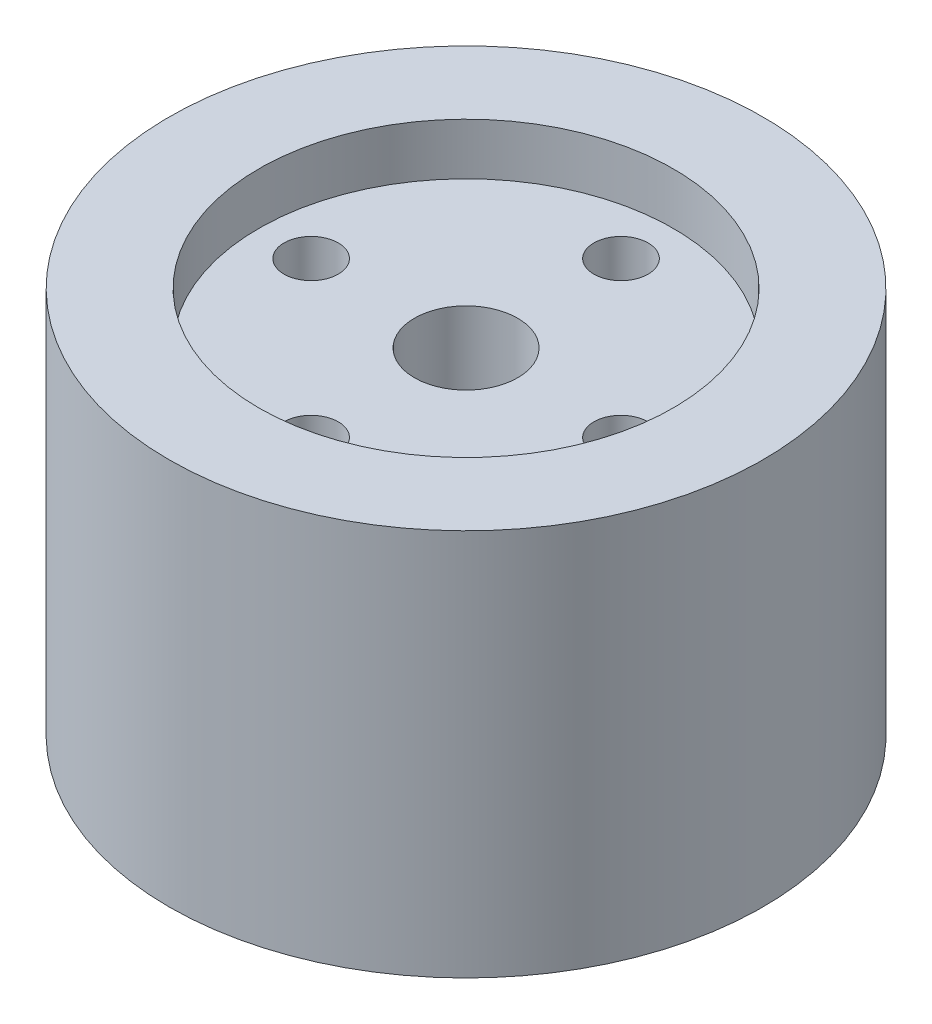
ISO-10303-21;
HEADER;
FILE_DESCRIPTION(('STEP AP214'),'2;1');
FILE_NAME('part.step','',(''),(''),'','','');
FILE_SCHEMA(('AUTOMOTIVE_DESIGN { 1 0 10303 214 1 1 1 1 }'));
ENDSEC;
DATA;
#1=APPLICATION_CONTEXT('core data for automotive mechanical design processes');
#2=APPLICATION_PROTOCOL_DEFINITION('international standard','automotive_design',2000,#1);
#3=PRODUCT_CONTEXT('',#1,'mechanical');
#4=PRODUCT('Part','Part','',(#3));
#5=PRODUCT_RELATED_PRODUCT_CATEGORY('part','',(#4));
#6=PRODUCT_DEFINITION_FORMATION('','',#4);
#7=PRODUCT_DEFINITION_CONTEXT('part definition',#1,'design');
#8=PRODUCT_DEFINITION('design','',#6,#7);
#9=PRODUCT_DEFINITION_SHAPE('','',#8);
#10=(LENGTH_UNIT() NAMED_UNIT(*) SI_UNIT(.MILLI.,.METRE.));
#11=(NAMED_UNIT(*) PLANE_ANGLE_UNIT() SI_UNIT($,.RADIAN.));
#12=(NAMED_UNIT(*) SI_UNIT($,.STERADIAN.) SOLID_ANGLE_UNIT());
#13=UNCERTAINTY_MEASURE_WITH_UNIT(LENGTH_MEASURE(1.E-05),#10,'distance_accuracy_value','');
#14=(GEOMETRIC_REPRESENTATION_CONTEXT(3) GLOBAL_UNCERTAINTY_ASSIGNED_CONTEXT((#13)) GLOBAL_UNIT_ASSIGNED_CONTEXT((#10,
#11,#12)) REPRESENTATION_CONTEXT('',''));
#15=CARTESIAN_POINT('',(0.,0.,0.));
#16=DIRECTION('',(0.,0.,1.));
#17=DIRECTION('',(1.,0.,0.));
#18=AXIS2_PLACEMENT_3D('',#15,#16,#17);
#19=CARTESIAN_POINT('',(0.,30.,-12.));
#20=DIRECTION('',(0.,-1.,0.));
#21=DIRECTION('',(0.,0.,-1.));
#22=AXIS2_PLACEMENT_3D('',#19,#20,#21);
#23=CYLINDRICAL_SURFACE('',#22,2.1);
#24=CARTESIAN_POINT('',(0.,26.,-12.));
#25=DIRECTION('',(0.,1.,0.));
#26=DIRECTION('',(0.,0.,1.));
#27=AXIS2_PLACEMENT_3D('',#24,#25,#26);
#28=CIRCLE('',#27,2.1);
#29=CARTESIAN_POINT('',(0.,26.,-9.9));
#30=VERTEX_POINT('',#29);
#31=EDGE_CURVE('E410',#30,#30,#28,.T.);
#32=ORIENTED_EDGE('',*,*,#31,.T.);
#33=EDGE_LOOP('',(#32));
#34=FACE_BOUND('',#33,.T.);
#35=CARTESIAN_POINT('',(0.,12.,-12.));
#36=DIRECTION('',(0.,-1.,0.));
#37=DIRECTION('',(0.,0.,-1.));
#38=AXIS2_PLACEMENT_3D('',#35,#36,#37);
#39=CIRCLE('',#38,2.1);
#40=CARTESIAN_POINT('',(0.,12.,-14.1));
#41=VERTEX_POINT('',#40);
#42=EDGE_CURVE('E41',#41,#41,#39,.T.);
#43=ORIENTED_EDGE('',*,*,#42,.T.);
#44=EDGE_LOOP('',(#43));
#45=FACE_BOUND('',#44,.T.);
#46=ADVANCED_FACE('F37',(#34,#45),#23,.F.);
#47=CARTESIAN_POINT('',(12.,30.,0.));
#48=DIRECTION('',(0.,-1.,0.));
#49=DIRECTION('',(0.,0.,-1.));
#50=AXIS2_PLACEMENT_3D('',#47,#48,#49);
#51=CYLINDRICAL_SURFACE('',#50,2.1);
#52=CARTESIAN_POINT('',(12.,26.,0.));
#53=DIRECTION('',(0.,1.,0.));
#54=DIRECTION('',(0.,0.,1.));
#55=AXIS2_PLACEMENT_3D('',#52,#53,#54);
#56=CIRCLE('',#55,2.1);
#57=CARTESIAN_POINT('',(12.,26.,2.10000000000004));
#58=VERTEX_POINT('',#57);
#59=EDGE_CURVE('E407',#58,#58,#56,.T.);
#60=ORIENTED_EDGE('',*,*,#59,.T.);
#61=EDGE_LOOP('',(#60));
#62=FACE_BOUND('',#61,.T.);
#63=CARTESIAN_POINT('',(12.,12.,0.));
#64=DIRECTION('',(0.,-1.,0.));
#65=DIRECTION('',(0.,0.,-1.));
#66=AXIS2_PLACEMENT_3D('',#63,#64,#65);
#67=CIRCLE('',#66,2.1);
#68=CARTESIAN_POINT('',(12.,12.,-2.09999999999996));
#69=VERTEX_POINT('',#68);
#70=EDGE_CURVE('E427',#69,#69,#67,.T.);
#71=ORIENTED_EDGE('',*,*,#70,.T.);
#72=EDGE_LOOP('',(#71));
#73=FACE_BOUND('',#72,.T.);
#74=ADVANCED_FACE('F516',(#62,#73),#51,.F.);
#75=CARTESIAN_POINT('',(0.,30.,12.));
#76=DIRECTION('',(0.,-1.,0.));
#77=DIRECTION('',(0.,0.,-1.));
#78=AXIS2_PLACEMENT_3D('',#75,#76,#77);
#79=CYLINDRICAL_SURFACE('',#78,2.1);
#80=CARTESIAN_POINT('',(0.,26.,12.));
#81=DIRECTION('',(0.,1.,0.));
#82=DIRECTION('',(0.,0.,1.));
#83=AXIS2_PLACEMENT_3D('',#80,#81,#82);
#84=CIRCLE('',#83,2.1);
#85=CARTESIAN_POINT('',(0.,26.,14.1));
#86=VERTEX_POINT('',#85);
#87=EDGE_CURVE('E404',#86,#86,#84,.T.);
#88=ORIENTED_EDGE('',*,*,#87,.T.);
#89=EDGE_LOOP('',(#88));
#90=FACE_BOUND('',#89,.T.);
#91=CARTESIAN_POINT('',(0.,12.,12.));
#92=DIRECTION('',(0.,-1.,0.));
#93=DIRECTION('',(0.,0.,-1.));
#94=AXIS2_PLACEMENT_3D('',#91,#92,#93);
#95=CIRCLE('',#94,2.1);
#96=CARTESIAN_POINT('',(0.,12.,9.9));
#97=VERTEX_POINT('',#96);
#98=EDGE_CURVE('E425',#97,#97,#95,.T.);
#99=ORIENTED_EDGE('',*,*,#98,.T.);
#100=EDGE_LOOP('',(#99));
#101=FACE_BOUND('',#100,.T.);
#102=ADVANCED_FACE('F522',(#90,#101),#79,.F.);
#103=CARTESIAN_POINT('',(-12.,30.,-1.25693328198353E-13));
#104=DIRECTION('',(0.,-1.,0.));
#105=DIRECTION('',(0.,0.,-1.));
#106=AXIS2_PLACEMENT_3D('',#103,#104,#105);
#107=CYLINDRICAL_SURFACE('',#106,2.1);
#108=CARTESIAN_POINT('',(-12.,26.,-1.25693328198353E-13));
#109=DIRECTION('',(0.,1.,0.));
#110=DIRECTION('',(0.,0.,1.));
#111=AXIS2_PLACEMENT_3D('',#108,#109,#110);
#112=CIRCLE('',#111,2.1);
#113=CARTESIAN_POINT('',(-12.,26.,2.09999999999987));
#114=VERTEX_POINT('',#113);
#115=EDGE_CURVE('E400',#114,#114,#112,.T.);
#116=ORIENTED_EDGE('',*,*,#115,.T.);
#117=EDGE_LOOP('',(#116));
#118=FACE_BOUND('',#117,.T.);
#119=CARTESIAN_POINT('',(-12.,12.,-1.25693328198353E-13));
#120=DIRECTION('',(0.,-1.,0.));
#121=DIRECTION('',(0.,0.,-1.));
#122=AXIS2_PLACEMENT_3D('',#119,#120,#121);
#123=CIRCLE('',#122,2.1);
#124=CARTESIAN_POINT('',(-12.,12.,-2.10000000000013));
#125=VERTEX_POINT('',#124);
#126=EDGE_CURVE('E248',#125,#125,#123,.T.);
#127=ORIENTED_EDGE('',*,*,#126,.T.);
#128=EDGE_LOOP('',(#127));
#129=FACE_BOUND('',#128,.T.);
#130=ADVANCED_FACE('F481',(#118,#129),#107,.F.);
#131=CARTESIAN_POINT('',(0.,30.,0.));
#132=DIRECTION('',(0.,-1.,0.));
#133=DIRECTION('',(0.,0.,-1.));
#134=AXIS2_PLACEMENT_3D('',#131,#132,#133);
#135=CYLINDRICAL_SURFACE('',#134,4.);
#136=CARTESIAN_POINT('',(0.,0.,0.));
#137=DIRECTION('',(0.,1.,0.));
#138=DIRECTION('',(0.,0.,1.));
#139=AXIS2_PLACEMENT_3D('',#136,#137,#138);
#140=CIRCLE('',#139,4.);
#141=CARTESIAN_POINT('',(0.,0.,4.));
#142=VERTEX_POINT('',#141);
#143=EDGE_CURVE('E416',#142,#142,#140,.T.);
#144=ORIENTED_EDGE('',*,*,#143,.F.);
#145=EDGE_LOOP('',(#144));
#146=FACE_BOUND('',#145,.T.);
#147=CARTESIAN_POINT('',(0.,26.,0.));
#148=DIRECTION('',(0.,1.,0.));
#149=DIRECTION('',(0.,0.,1.));
#150=AXIS2_PLACEMENT_3D('',#147,#148,#149);
#151=CIRCLE('',#150,4.);
#152=CARTESIAN_POINT('',(0.,26.,4.));
#153=VERTEX_POINT('',#152);
#154=EDGE_CURVE('E413',#153,#153,#151,.T.);
#155=ORIENTED_EDGE('',*,*,#154,.T.);
#156=EDGE_LOOP('',(#155));
#157=FACE_BOUND('',#156,.T.);
#158=ADVANCED_FACE('F478',(#146,#157),#135,.F.);
#159=CARTESIAN_POINT('',(0.,30.,0.));
#160=DIRECTION('',(0.,1.,0.));
#161=DIRECTION('',(0.,0.,1.));
#162=AXIS2_PLACEMENT_3D('',#159,#160,#161);
#163=PLANE('',#162);
#164=CARTESIAN_POINT('',(0.,30.,0.));
#165=DIRECTION('',(0.,1.,0.));
#166=DIRECTION('',(0.,0.,1.));
#167=AXIS2_PLACEMENT_3D('',#164,#165,#166);
#168=CIRCLE('',#167,16.05);
#169=CARTESIAN_POINT('',(0.,30.,16.05));
#170=VERTEX_POINT('',#169);
#171=EDGE_CURVE('E401',#170,#170,#168,.T.);
#172=ORIENTED_EDGE('',*,*,#171,.F.);
#173=EDGE_LOOP('',(#172));
#174=FACE_BOUND('',#173,.T.);
#175=CARTESIAN_POINT('',(0.,30.,0.));
#176=DIRECTION('',(0.,1.,0.));
#177=DIRECTION('',(0.,0.,1.));
#178=AXIS2_PLACEMENT_3D('',#175,#176,#177);
#179=CIRCLE('',#178,23.);
#180=CARTESIAN_POINT('',(0.,30.,23.));
#181=VERTEX_POINT('',#180);
#182=EDGE_CURVE('E11',#181,#181,#179,.T.);
#183=ORIENTED_EDGE('',*,*,#182,.T.);
#184=EDGE_LOOP('',(#183));
#185=FACE_BOUND('',#184,.T.);
#186=ADVANCED_FACE('F468',(#174,#185),#163,.T.);
#187=CARTESIAN_POINT('',(0.,0.,0.));
#188=DIRECTION('',(0.,1.,0.));
#189=DIRECTION('',(0.,0.,1.));
#190=AXIS2_PLACEMENT_3D('',#187,#188,#189);
#191=PLANE('',#190);
#192=DIRECTION('',(-0.5,0.,0.866025403784438));
#193=VECTOR('',#192,1.);
#194=CARTESIAN_POINT('',(4.15692193816522,0.,12.));
#195=LINE('',#194,#193);
#196=CARTESIAN_POINT('',(4.15692193816522,0.,12.));
#197=VERTEX_POINT('',#196);
#198=CARTESIAN_POINT('',(2.07846096908257,0.,15.6));
#199=VERTEX_POINT('',#198);
#200=EDGE_CURVE('E235',#197,#199,#195,.T.);
#201=ORIENTED_EDGE('',*,*,#200,.F.);
#202=DIRECTION('',(0.499999999999999,0.,0.866025403784439));
#203=VECTOR('',#202,1.);
#204=CARTESIAN_POINT('',(2.07846096908257,0.,8.4));
#205=LINE('',#204,#203);
#206=CARTESIAN_POINT('',(2.07846096908257,0.,8.4));
#207=VERTEX_POINT('',#206);
#208=EDGE_CURVE('E54',#207,#197,#205,.T.);
#209=ORIENTED_EDGE('',*,*,#208,.F.);
#210=DIRECTION('',(1.,0.,0.));
#211=VECTOR('',#210,1.);
#212=CARTESIAN_POINT('',(-2.07846096908273,0.,8.4));
#213=LINE('',#212,#211);
#214=CARTESIAN_POINT('',(-2.07846096908273,0.,8.4));
#215=VERTEX_POINT('',#214);
#216=EDGE_CURVE('E221',#215,#207,#213,.T.);
#217=ORIENTED_EDGE('',*,*,#216,.F.);
#218=DIRECTION('',(0.500000000000001,0.,-0.866025403784438));
#219=VECTOR('',#218,1.);
#220=CARTESIAN_POINT('',(-4.15692193816539,0.,12.));
#221=LINE('',#220,#219);
#222=CARTESIAN_POINT('',(-4.15692193816539,0.,12.));
#223=VERTEX_POINT('',#222);
#224=EDGE_CURVE('E224',#223,#215,#221,.T.);
#225=ORIENTED_EDGE('',*,*,#224,.F.);
#226=DIRECTION('',(-0.5,0.,-0.866025403784439));
#227=VECTOR('',#226,1.);
#228=CARTESIAN_POINT('',(-2.07846096908273,0.,15.6));
#229=LINE('',#228,#227);
#230=CARTESIAN_POINT('',(-2.07846096908273,0.,15.6));
#231=VERTEX_POINT('',#230);
#232=EDGE_CURVE('E241',#231,#223,#229,.T.);
#233=ORIENTED_EDGE('',*,*,#232,.F.);
#234=DIRECTION('',(-1.,0.,0.));
#235=VECTOR('',#234,1.);
#236=CARTESIAN_POINT('',(2.07846096908257,0.,15.6));
#237=LINE('',#236,#235);
#238=EDGE_CURVE('E238',#199,#231,#237,.T.);
#239=ORIENTED_EDGE('',*,*,#238,.F.);
#240=EDGE_LOOP('',(#201,#209,#217,#225,#233,#239));
#241=FACE_BOUND('',#240,.T.);
#242=DIRECTION('',(0.866025403784439,0.,0.5));
#243=VECTOR('',#242,1.);
#244=CARTESIAN_POINT('',(12.0000000000001,0.,-4.15692193816508));
#245=LINE('',#244,#243);
#246=CARTESIAN_POINT('',(12.0000000000001,0.,-4.15692193816508));
#247=VERTEX_POINT('',#246);
#248=CARTESIAN_POINT('',(15.6000000000001,0.,-2.07846096908242));
#249=VERTEX_POINT('',#248);
#250=EDGE_CURVE('E277',#247,#249,#245,.T.);
#251=ORIENTED_EDGE('',*,*,#250,.F.);
#252=DIRECTION('',(0.866025403784439,0.,-0.499999999999999));
#253=VECTOR('',#252,1.);
#254=CARTESIAN_POINT('',(8.40000000000009,0.,-2.07846096908243));
#255=LINE('',#254,#253);
#256=CARTESIAN_POINT('',(8.40000000000009,0.,-2.07846096908243));
#257=VERTEX_POINT('',#256);
#258=EDGE_CURVE('E62',#257,#247,#255,.T.);
#259=ORIENTED_EDGE('',*,*,#258,.F.);
#260=DIRECTION('',(0.,0.,-1.));
#261=VECTOR('',#260,1.);
#262=CARTESIAN_POINT('',(8.40000000000009,0.,2.07846096908288));
#263=LINE('',#262,#261);
#264=CARTESIAN_POINT('',(8.40000000000009,0.,2.07846096908288));
#265=VERTEX_POINT('',#264);
#266=EDGE_CURVE('E260',#265,#257,#263,.T.);
#267=ORIENTED_EDGE('',*,*,#266,.F.);
#268=DIRECTION('',(-0.866025403784438,0.,-0.500000000000001));
#269=VECTOR('',#268,1.);
#270=CARTESIAN_POINT('',(12.0000000000001,0.,4.15692193816553));
#271=LINE('',#270,#269);
#272=CARTESIAN_POINT('',(12.0000000000001,0.,4.15692193816553));
#273=VERTEX_POINT('',#272);
#274=EDGE_CURVE('E287',#273,#265,#271,.T.);
#275=ORIENTED_EDGE('',*,*,#274,.F.);
#276=DIRECTION('',(-0.866025403784439,0.,0.5));
#277=VECTOR('',#276,1.);
#278=CARTESIAN_POINT('',(15.6000000000001,0.,2.07846096908288));
#279=LINE('',#278,#277);
#280=CARTESIAN_POINT('',(15.6000000000001,0.,2.07846096908288));
#281=VERTEX_POINT('',#280);
#282=EDGE_CURVE('E284',#281,#273,#279,.T.);
#283=ORIENTED_EDGE('',*,*,#282,.F.);
#284=DIRECTION('',(0.,0.,1.));
#285=VECTOR('',#284,1.);
#286=CARTESIAN_POINT('',(15.6000000000001,0.,-2.07846096908242));
#287=LINE('',#286,#285);
#288=EDGE_CURVE('E281',#249,#281,#287,.T.);
#289=ORIENTED_EDGE('',*,*,#288,.F.);
#290=EDGE_LOOP('',(#251,#259,#267,#275,#283,#289));
#291=FACE_BOUND('',#290,.T.);
#292=DIRECTION('',(0.5,0.,-0.866025403784438));
#293=VECTOR('',#292,1.);
#294=CARTESIAN_POINT('',(-4.15692193816499,0.,-11.9999999999999));
#295=LINE('',#294,#293);
#296=CARTESIAN_POINT('',(-4.15692193816499,0.,-11.9999999999999));
#297=VERTEX_POINT('',#296);
#298=CARTESIAN_POINT('',(-2.07846096908233,0.,-15.5999999999999));
#299=VERTEX_POINT('',#298);
#300=EDGE_CURVE('E324',#297,#299,#295,.T.);
#301=ORIENTED_EDGE('',*,*,#300,.F.);
#302=DIRECTION('',(-0.499999999999999,0.,-0.866025403784439));
#303=VECTOR('',#302,1.);
#304=CARTESIAN_POINT('',(-2.07846096908234,0.,-8.39999999999994));
#305=LINE('',#304,#303);
#306=CARTESIAN_POINT('',(-2.07846096908234,0.,-8.39999999999994));
#307=VERTEX_POINT('',#306);
#308=EDGE_CURVE('E322',#307,#297,#305,.T.);
#309=ORIENTED_EDGE('',*,*,#308,.F.);
#310=DIRECTION('',(-1.,0.,0.));
#311=VECTOR('',#310,1.);
#312=CARTESIAN_POINT('',(2.07846096908297,0.,-8.39999999999995));
#313=LINE('',#312,#311);
#314=CARTESIAN_POINT('',(2.07846096908297,0.,-8.39999999999995));
#315=VERTEX_POINT('',#314);
#316=EDGE_CURVE('E306',#315,#307,#313,.T.);
#317=ORIENTED_EDGE('',*,*,#316,.F.);
#318=DIRECTION('',(-0.500000000000001,0.,0.866025403784438));
#319=VECTOR('',#318,1.);
#320=CARTESIAN_POINT('',(4.15692193816562,0.,-11.9999999999999));
#321=LINE('',#320,#319);
#322=CARTESIAN_POINT('',(4.15692193816562,0.,-11.9999999999999));
#323=VERTEX_POINT('',#322);
#324=EDGE_CURVE('E334',#323,#315,#321,.T.);
#325=ORIENTED_EDGE('',*,*,#324,.F.);
#326=DIRECTION('',(0.5,0.,0.866025403784439));
#327=VECTOR('',#326,1.);
#328=CARTESIAN_POINT('',(2.07846096908297,0.,-15.5999999999999));
#329=LINE('',#328,#327);
#330=CARTESIAN_POINT('',(2.07846096908297,0.,-15.5999999999999));
#331=VERTEX_POINT('',#330);
#332=EDGE_CURVE('E331',#331,#323,#329,.T.);
#333=ORIENTED_EDGE('',*,*,#332,.F.);
#334=DIRECTION('',(1.,0.,0.));
#335=VECTOR('',#334,1.);
#336=CARTESIAN_POINT('',(-2.07846096908233,0.,-15.5999999999999));
#337=LINE('',#336,#335);
#338=EDGE_CURVE('E328',#299,#331,#337,.T.);
#339=ORIENTED_EDGE('',*,*,#338,.F.);
#340=EDGE_LOOP('',(#301,#309,#317,#325,#333,#339));
#341=FACE_BOUND('',#340,.T.);
#342=DIRECTION('',(-0.866025403784438,0.,-0.500000000000001));
#343=VECTOR('',#342,1.);
#344=CARTESIAN_POINT('',(-11.9999999999999,0.,4.15692193816514));
#345=LINE('',#344,#343);
#346=CARTESIAN_POINT('',(-11.9999999999999,0.,4.15692193816514));
#347=VERTEX_POINT('',#346);
#348=CARTESIAN_POINT('',(-15.5999999999999,0.,2.07846096908248));
#349=VERTEX_POINT('',#348);
#350=EDGE_CURVE('E372',#347,#349,#345,.T.);
#351=ORIENTED_EDGE('',*,*,#350,.F.);
#352=DIRECTION('',(-0.866025403784439,0.,0.499999999999999));
#353=VECTOR('',#352,1.);
#354=CARTESIAN_POINT('',(-8.39999999999986,0.,2.07846096908249));
#355=LINE('',#354,#353);
#356=CARTESIAN_POINT('',(-8.39999999999986,0.,2.07846096908249));
#357=VERTEX_POINT('',#356);
#358=EDGE_CURVE('E370',#357,#347,#355,.T.);
#359=ORIENTED_EDGE('',*,*,#358,.F.);
#360=DIRECTION('',(0.,0.,1.));
#361=VECTOR('',#360,1.);
#362=CARTESIAN_POINT('',(-8.39999999999985,0.,-2.07846096908282));
#363=LINE('',#362,#361);
#364=CARTESIAN_POINT('',(-8.39999999999985,0.,-2.07846096908282));
#365=VERTEX_POINT('',#364);
#366=EDGE_CURVE('E354',#365,#357,#363,.T.);
#367=ORIENTED_EDGE('',*,*,#366,.F.);
#368=DIRECTION('',(0.866025403784438,0.,0.500000000000001));
#369=VECTOR('',#368,1.);
#370=CARTESIAN_POINT('',(-11.9999999999999,0.,-4.15692193816548));
#371=LINE('',#370,#369);
#372=CARTESIAN_POINT('',(-11.9999999999999,0.,-4.15692193816548));
#373=VERTEX_POINT('',#372);
#374=EDGE_CURVE('E381',#373,#365,#371,.T.);
#375=ORIENTED_EDGE('',*,*,#374,.F.);
#376=DIRECTION('',(0.866025403784439,0.,-0.499999999999999));
#377=VECTOR('',#376,1.);
#378=CARTESIAN_POINT('',(-15.5999999999999,0.,-2.07846096908283));
#379=LINE('',#378,#377);
#380=CARTESIAN_POINT('',(-15.5999999999999,0.,-2.07846096908283));
#381=VERTEX_POINT('',#380);
#382=EDGE_CURVE('E378',#381,#373,#379,.T.);
#383=ORIENTED_EDGE('',*,*,#382,.F.);
#384=DIRECTION('',(0.,0.,-1.));
#385=VECTOR('',#384,1.);
#386=CARTESIAN_POINT('',(-15.5999999999999,0.,2.07846096908248));
#387=LINE('',#386,#385);
#388=EDGE_CURVE('E375',#349,#381,#387,.T.);
#389=ORIENTED_EDGE('',*,*,#388,.F.);
#390=EDGE_LOOP('',(#351,#359,#367,#375,#383,#389));
#391=FACE_BOUND('',#390,.T.);
#392=CARTESIAN_POINT('',(0.,0.,0.));
#393=DIRECTION('',(0.,1.,0.));
#394=DIRECTION('',(0.,0.,1.));
#395=AXIS2_PLACEMENT_3D('',#392,#393,#394);
#396=CIRCLE('',#395,23.);
#397=CARTESIAN_POINT('',(0.,0.,23.));
#398=VERTEX_POINT('',#397);
#399=EDGE_CURVE('E46',#398,#398,#396,.T.);
#400=ORIENTED_EDGE('',*,*,#399,.F.);
#401=EDGE_LOOP('',(#400));
#402=FACE_BOUND('',#401,.T.);
#403=ORIENTED_EDGE('',*,*,#143,.T.);
#404=EDGE_LOOP('',(#403));
#405=FACE_BOUND('',#404,.T.);
#406=ADVANCED_FACE('F465',(#241,#291,#341,#391,#402,#405),#191,.F.);
#407=CARTESIAN_POINT('',(0.,30.,0.));
#408=DIRECTION('',(0.,-1.,0.));
#409=DIRECTION('',(0.,0.,-1.));
#410=AXIS2_PLACEMENT_3D('',#407,#408,#409);
#411=CYLINDRICAL_SURFACE('',#410,23.);
#412=ORIENTED_EDGE('',*,*,#182,.F.);
#413=EDGE_LOOP('',(#412));
#414=FACE_BOUND('',#413,.T.);
#415=ORIENTED_EDGE('',*,*,#399,.T.);
#416=EDGE_LOOP('',(#415));
#417=FACE_BOUND('',#416,.T.);
#418=ADVANCED_FACE('F39',(#414,#417),#411,.T.);
#419=CARTESIAN_POINT('',(0.,26.,0.));
#420=DIRECTION('',(0.,1.,0.));
#421=DIRECTION('',(0.,0.,1.));
#422=AXIS2_PLACEMENT_3D('',#419,#420,#421);
#423=CYLINDRICAL_SURFACE('',#422,16.05);
#424=CARTESIAN_POINT('',(0.,26.,0.));
#425=DIRECTION('',(0.,1.,0.));
#426=DIRECTION('',(0.,0.,1.));
#427=AXIS2_PLACEMENT_3D('',#424,#425,#426);
#428=CIRCLE('',#427,16.05);
#429=CARTESIAN_POINT('',(0.,26.,16.05));
#430=VERTEX_POINT('',#429);
#431=EDGE_CURVE('E397',#430,#430,#428,.T.);
#432=ORIENTED_EDGE('',*,*,#431,.F.);
#433=EDGE_LOOP('',(#432));
#434=FACE_BOUND('',#433,.T.);
#435=ORIENTED_EDGE('',*,*,#171,.T.);
#436=EDGE_LOOP('',(#435));
#437=FACE_BOUND('',#436,.T.);
#438=ADVANCED_FACE('F489',(#434,#437),#423,.F.);
#439=CARTESIAN_POINT('',(0.,26.,0.));
#440=DIRECTION('',(0.,1.,0.));
#441=DIRECTION('',(0.,0.,1.));
#442=AXIS2_PLACEMENT_3D('',#439,#440,#441);
#443=PLANE('',#442);
#444=ORIENTED_EDGE('',*,*,#154,.F.);
#445=EDGE_LOOP('',(#444));
#446=FACE_BOUND('',#445,.T.);
#447=ORIENTED_EDGE('',*,*,#31,.F.);
#448=EDGE_LOOP('',(#447));
#449=FACE_BOUND('',#448,.T.);
#450=ORIENTED_EDGE('',*,*,#59,.F.);
#451=EDGE_LOOP('',(#450));
#452=FACE_BOUND('',#451,.T.);
#453=ORIENTED_EDGE('',*,*,#87,.F.);
#454=EDGE_LOOP('',(#453));
#455=FACE_BOUND('',#454,.T.);
#456=ORIENTED_EDGE('',*,*,#115,.F.);
#457=EDGE_LOOP('',(#456));
#458=FACE_BOUND('',#457,.T.);
#459=ORIENTED_EDGE('',*,*,#431,.T.);
#460=EDGE_LOOP('',(#459));
#461=FACE_BOUND('',#460,.T.);
#462=ADVANCED_FACE('F485',(#446,#449,#452,#455,#458,#461),#443,.T.);
#463=CARTESIAN_POINT('',(-8.39999999999986,12.,2.07846096908249));
#464=DIRECTION('',(0.5,0.,0.866025403784439));
#465=DIRECTION('',(0.866025403784439,0.,-0.5));
#466=AXIS2_PLACEMENT_3D('',#463,#464,#465);
#467=PLANE('',#466);
#468=ORIENTED_EDGE('',*,*,#358,.T.);
#469=DIRECTION('',(0.,-1.,0.));
#470=VECTOR('',#469,1.);
#471=CARTESIAN_POINT('',(-11.9999999999999,12.,4.15692193816514));
#472=LINE('',#471,#470);
#473=CARTESIAN_POINT('',(-11.9999999999999,12.,4.15692193816514));
#474=VERTEX_POINT('',#473);
#475=EDGE_CURVE('E369',#474,#347,#472,.T.);
#476=ORIENTED_EDGE('',*,*,#475,.F.);
#477=DIRECTION('',(-0.866025403784439,0.,0.499999999999999));
#478=VECTOR('',#477,1.);
#479=CARTESIAN_POINT('',(-8.39999999999986,12.,2.07846096908249));
#480=LINE('',#479,#478);
#481=CARTESIAN_POINT('',(-8.39999999999986,12.,2.07846096908249));
#482=VERTEX_POINT('',#481);
#483=EDGE_CURVE('E350',#482,#474,#480,.T.);
#484=ORIENTED_EDGE('',*,*,#483,.F.);
#485=DIRECTION('',(0.,-1.,0.));
#486=VECTOR('',#485,1.);
#487=CARTESIAN_POINT('',(-8.39999999999986,12.,2.07846096908249));
#488=LINE('',#487,#486);
#489=EDGE_CURVE('E325',#482,#357,#488,.T.);
#490=ORIENTED_EDGE('',*,*,#489,.T.);
#491=EDGE_LOOP('',(#468,#476,#484,#490));
#492=FACE_BOUND('',#491,.T.);
#493=ADVANCED_FACE('F488',(#492),#467,.F.);
#494=CARTESIAN_POINT('',(-8.39999999999985,12.,-2.07846096908282));
#495=DIRECTION('',(1.,0.,0.));
#496=DIRECTION('',(0.,0.,-1.));
#497=AXIS2_PLACEMENT_3D('',#494,#495,#496);
#498=PLANE('',#497);
#499=ORIENTED_EDGE('',*,*,#366,.T.);
#500=ORIENTED_EDGE('',*,*,#489,.F.);
#501=DIRECTION('',(0.,0.,1.));
#502=VECTOR('',#501,1.);
#503=CARTESIAN_POINT('',(-8.39999999999985,12.,-2.07846096908282));
#504=LINE('',#503,#502);
#505=CARTESIAN_POINT('',(-8.39999999999985,12.,-2.07846096908282));
#506=VERTEX_POINT('',#505);
#507=EDGE_CURVE('E366',#506,#482,#504,.T.);
#508=ORIENTED_EDGE('',*,*,#507,.F.);
#509=DIRECTION('',(0.,-1.,0.));
#510=VECTOR('',#509,1.);
#511=CARTESIAN_POINT('',(-8.39999999999985,12.,-2.07846096908282));
#512=LINE('',#511,#510);
#513=EDGE_CURVE('E387',#506,#365,#512,.T.);
#514=ORIENTED_EDGE('',*,*,#513,.T.);
#515=EDGE_LOOP('',(#499,#500,#508,#514));
#516=FACE_BOUND('',#515,.T.);
#517=ADVANCED_FACE('F534',(#516),#498,.F.);
#518=CARTESIAN_POINT('',(-11.9999999999999,12.,-4.15692193816548));
#519=DIRECTION('',(0.500000000000001,0.,-0.866025403784438));
#520=DIRECTION('',(-0.866025403784438,0.,-0.500000000000001));
#521=AXIS2_PLACEMENT_3D('',#518,#519,#520);
#522=PLANE('',#521);
#523=ORIENTED_EDGE('',*,*,#374,.T.);
#524=ORIENTED_EDGE('',*,*,#513,.F.);
#525=DIRECTION('',(0.866025403784438,0.,0.500000000000001));
#526=VECTOR('',#525,1.);
#527=CARTESIAN_POINT('',(-11.9999999999999,12.,-4.15692193816548));
#528=LINE('',#527,#526);
#529=CARTESIAN_POINT('',(-11.9999999999999,12.,-4.15692193816548));
#530=VERTEX_POINT('',#529);
#531=EDGE_CURVE('E363',#530,#506,#528,.T.);
#532=ORIENTED_EDGE('',*,*,#531,.F.);
#533=DIRECTION('',(0.,-1.,0.));
#534=VECTOR('',#533,1.);
#535=CARTESIAN_POINT('',(-11.9999999999999,12.,-4.15692193816548));
#536=LINE('',#535,#534);
#537=EDGE_CURVE('E389',#530,#373,#536,.T.);
#538=ORIENTED_EDGE('',*,*,#537,.T.);
#539=EDGE_LOOP('',(#523,#524,#532,#538));
#540=FACE_BOUND('',#539,.T.);
#541=ADVANCED_FACE('F548',(#540),#522,.F.);
#542=CARTESIAN_POINT('',(-15.5999999999999,12.,-2.07846096908283));
#543=DIRECTION('',(-0.5,0.,-0.866025403784439));
#544=DIRECTION('',(-0.866025403784439,0.,0.5));
#545=AXIS2_PLACEMENT_3D('',#542,#543,#544);
#546=PLANE('',#545);
#547=ORIENTED_EDGE('',*,*,#382,.T.);
#548=ORIENTED_EDGE('',*,*,#537,.F.);
#549=DIRECTION('',(0.866025403784439,0.,-0.499999999999999));
#550=VECTOR('',#549,1.);
#551=CARTESIAN_POINT('',(-15.5999999999999,12.,-2.07846096908283));
#552=LINE('',#551,#550);
#553=CARTESIAN_POINT('',(-15.5999999999999,12.,-2.07846096908283));
#554=VERTEX_POINT('',#553);
#555=EDGE_CURVE('E360',#554,#530,#552,.T.);
#556=ORIENTED_EDGE('',*,*,#555,.F.);
#557=DIRECTION('',(0.,-1.,0.));
#558=VECTOR('',#557,1.);
#559=CARTESIAN_POINT('',(-15.5999999999999,12.,-2.07846096908283));
#560=LINE('',#559,#558);
#561=EDGE_CURVE('E391',#554,#381,#560,.T.);
#562=ORIENTED_EDGE('',*,*,#561,.T.);
#563=EDGE_LOOP('',(#547,#548,#556,#562));
#564=FACE_BOUND('',#563,.T.);
#565=ADVANCED_FACE('F544',(#564),#546,.F.);
#566=CARTESIAN_POINT('',(-15.5999999999999,12.,2.07846096908248));
#567=DIRECTION('',(-1.,0.,0.));
#568=DIRECTION('',(0.,0.,1.));
#569=AXIS2_PLACEMENT_3D('',#566,#567,#568);
#570=PLANE('',#569);
#571=ORIENTED_EDGE('',*,*,#388,.T.);
#572=ORIENTED_EDGE('',*,*,#561,.F.);
#573=DIRECTION('',(0.,0.,-1.));
#574=VECTOR('',#573,1.);
#575=CARTESIAN_POINT('',(-15.5999999999999,12.,2.07846096908248));
#576=LINE('',#575,#574);
#577=CARTESIAN_POINT('',(-15.5999999999999,12.,2.07846096908248));
#578=VERTEX_POINT('',#577);
#579=EDGE_CURVE('E357',#578,#554,#576,.T.);
#580=ORIENTED_EDGE('',*,*,#579,.F.);
#581=DIRECTION('',(0.,-1.,0.));
#582=VECTOR('',#581,1.);
#583=CARTESIAN_POINT('',(-15.5999999999999,12.,2.07846096908248));
#584=LINE('',#583,#582);
#585=EDGE_CURVE('E393',#578,#349,#584,.T.);
#586=ORIENTED_EDGE('',*,*,#585,.T.);
#587=EDGE_LOOP('',(#571,#572,#580,#586));
#588=FACE_BOUND('',#587,.T.);
#589=ADVANCED_FACE('F540',(#588),#570,.F.);
#590=CARTESIAN_POINT('',(-11.9999999999999,12.,4.15692193816514));
#591=DIRECTION('',(-0.500000000000001,0.,0.866025403784438));
#592=DIRECTION('',(0.866025403784438,0.,0.500000000000001));
#593=AXIS2_PLACEMENT_3D('',#590,#591,#592);
#594=PLANE('',#593);
#595=ORIENTED_EDGE('',*,*,#350,.T.);
#596=ORIENTED_EDGE('',*,*,#585,.F.);
#597=DIRECTION('',(-0.866025403784438,0.,-0.500000000000001));
#598=VECTOR('',#597,1.);
#599=CARTESIAN_POINT('',(-11.9999999999999,12.,4.15692193816514));
#600=LINE('',#599,#598);
#601=EDGE_CURVE('E353',#474,#578,#600,.T.);
#602=ORIENTED_EDGE('',*,*,#601,.F.);
#603=ORIENTED_EDGE('',*,*,#475,.T.);
#604=EDGE_LOOP('',(#595,#596,#602,#603));
#605=FACE_BOUND('',#604,.T.);
#606=ADVANCED_FACE('F536',(#605),#594,.F.);
#607=CARTESIAN_POINT('',(0.,12.,0.));
#608=DIRECTION('',(0.,-1.,0.));
#609=DIRECTION('',(0.,0.,-1.));
#610=AXIS2_PLACEMENT_3D('',#607,#608,#609);
#611=PLANE('',#610);
#612=ORIENTED_EDGE('',*,*,#126,.F.);
#613=EDGE_LOOP('',(#612));
#614=FACE_BOUND('',#613,.T.);
#615=ORIENTED_EDGE('',*,*,#483,.T.);
#616=ORIENTED_EDGE('',*,*,#601,.T.);
#617=ORIENTED_EDGE('',*,*,#579,.T.);
#618=ORIENTED_EDGE('',*,*,#555,.T.);
#619=ORIENTED_EDGE('',*,*,#531,.T.);
#620=ORIENTED_EDGE('',*,*,#507,.T.);
#621=EDGE_LOOP('',(#615,#616,#617,#618,#619,#620));
#622=FACE_BOUND('',#621,.T.);
#623=ADVANCED_FACE('F539',(#614,#622),#611,.T.);
#624=CARTESIAN_POINT('',(-2.07846096908234,12.,-8.39999999999994));
#625=DIRECTION('',(-0.866025403784439,0.,0.499999999999999));
#626=DIRECTION('',(0.499999999999999,0.,0.866025403784439));
#627=AXIS2_PLACEMENT_3D('',#624,#625,#626);
#628=PLANE('',#627);
#629=ORIENTED_EDGE('',*,*,#308,.T.);
#630=DIRECTION('',(0.,-1.,0.));
#631=VECTOR('',#630,1.);
#632=CARTESIAN_POINT('',(-4.15692193816499,12.,-11.9999999999999));
#633=LINE('',#632,#631);
#634=CARTESIAN_POINT('',(-4.15692193816499,12.,-11.9999999999999));
#635=VERTEX_POINT('',#634);
#636=EDGE_CURVE('E321',#635,#297,#633,.T.);
#637=ORIENTED_EDGE('',*,*,#636,.F.);
#638=DIRECTION('',(-0.499999999999999,0.,-0.866025403784439));
#639=VECTOR('',#638,1.);
#640=CARTESIAN_POINT('',(-2.07846096908234,12.,-8.39999999999994));
#641=LINE('',#640,#639);
#642=CARTESIAN_POINT('',(-2.07846096908234,12.,-8.39999999999994));
#643=VERTEX_POINT('',#642);
#644=EDGE_CURVE('E302',#643,#635,#641,.T.);
#645=ORIENTED_EDGE('',*,*,#644,.F.);
#646=DIRECTION('',(0.,-1.,0.));
#647=VECTOR('',#646,1.);
#648=CARTESIAN_POINT('',(-2.07846096908234,12.,-8.39999999999994));
#649=LINE('',#648,#647);
#650=EDGE_CURVE('E278',#643,#307,#649,.T.);
#651=ORIENTED_EDGE('',*,*,#650,.T.);
#652=EDGE_LOOP('',(#629,#637,#645,#651));
#653=FACE_BOUND('',#652,.T.);
#654=ADVANCED_FACE('F445',(#653),#628,.F.);
#655=CARTESIAN_POINT('',(2.07846096908297,12.,-8.39999999999995));
#656=DIRECTION('',(0.,0.,1.));
#657=DIRECTION('',(1.,0.,0.));
#658=AXIS2_PLACEMENT_3D('',#655,#656,#657);
#659=PLANE('',#658);
#660=ORIENTED_EDGE('',*,*,#316,.T.);
#661=ORIENTED_EDGE('',*,*,#650,.F.);
#662=DIRECTION('',(-1.,0.,0.));
#663=VECTOR('',#662,1.);
#664=CARTESIAN_POINT('',(2.07846096908297,12.,-8.39999999999995));
#665=LINE('',#664,#663);
#666=CARTESIAN_POINT('',(2.07846096908297,12.,-8.39999999999995));
#667=VERTEX_POINT('',#666);
#668=EDGE_CURVE('E318',#667,#643,#665,.T.);
#669=ORIENTED_EDGE('',*,*,#668,.F.);
#670=DIRECTION('',(0.,-1.,0.));
#671=VECTOR('',#670,1.);
#672=CARTESIAN_POINT('',(2.07846096908297,12.,-8.39999999999995));
#673=LINE('',#672,#671);
#674=EDGE_CURVE('E340',#667,#315,#673,.T.);
#675=ORIENTED_EDGE('',*,*,#674,.T.);
#676=EDGE_LOOP('',(#660,#661,#669,#675));
#677=FACE_BOUND('',#676,.T.);
#678=ADVANCED_FACE('F463',(#677),#659,.F.);
#679=CARTESIAN_POINT('',(4.15692193816562,12.,-11.9999999999999));
#680=DIRECTION('',(0.866025403784438,0.,0.500000000000001));
#681=DIRECTION('',(0.500000000000001,0.,-0.866025403784438));
#682=AXIS2_PLACEMENT_3D('',#679,#680,#681);
#683=PLANE('',#682);
#684=ORIENTED_EDGE('',*,*,#324,.T.);
#685=ORIENTED_EDGE('',*,*,#674,.F.);
#686=DIRECTION('',(-0.500000000000001,0.,0.866025403784438));
#687=VECTOR('',#686,1.);
#688=CARTESIAN_POINT('',(4.15692193816562,12.,-11.9999999999999));
#689=LINE('',#688,#687);
#690=CARTESIAN_POINT('',(4.15692193816562,12.,-11.9999999999999));
#691=VERTEX_POINT('',#690);
#692=EDGE_CURVE('E315',#691,#667,#689,.T.);
#693=ORIENTED_EDGE('',*,*,#692,.F.);
#694=DIRECTION('',(0.,-1.,0.));
#695=VECTOR('',#694,1.);
#696=CARTESIAN_POINT('',(4.15692193816562,12.,-11.9999999999999));
#697=LINE('',#696,#695);
#698=EDGE_CURVE('E342',#691,#323,#697,.T.);
#699=ORIENTED_EDGE('',*,*,#698,.T.);
#700=EDGE_LOOP('',(#684,#685,#693,#699));
#701=FACE_BOUND('',#700,.T.);
#702=ADVANCED_FACE('F460',(#701),#683,.F.);
#703=CARTESIAN_POINT('',(2.07846096908297,12.,-15.5999999999999));
#704=DIRECTION('',(0.866025403784439,0.,-0.5));
#705=DIRECTION('',(-0.5,0.,-0.866025403784439));
#706=AXIS2_PLACEMENT_3D('',#703,#704,#705);
#707=PLANE('',#706);
#708=ORIENTED_EDGE('',*,*,#332,.T.);
#709=ORIENTED_EDGE('',*,*,#698,.F.);
#710=DIRECTION('',(0.5,0.,0.866025403784439));
#711=VECTOR('',#710,1.);
#712=CARTESIAN_POINT('',(2.07846096908297,12.,-15.5999999999999));
#713=LINE('',#712,#711);
#714=CARTESIAN_POINT('',(2.07846096908297,12.,-15.5999999999999));
#715=VERTEX_POINT('',#714);
#716=EDGE_CURVE('E312',#715,#691,#713,.T.);
#717=ORIENTED_EDGE('',*,*,#716,.F.);
#718=DIRECTION('',(0.,-1.,0.));
#719=VECTOR('',#718,1.);
#720=CARTESIAN_POINT('',(2.07846096908297,12.,-15.5999999999999));
#721=LINE('',#720,#719);
#722=EDGE_CURVE('E344',#715,#331,#721,.T.);
#723=ORIENTED_EDGE('',*,*,#722,.T.);
#724=EDGE_LOOP('',(#708,#709,#717,#723));
#725=FACE_BOUND('',#724,.T.);
#726=ADVANCED_FACE('F456',(#725),#707,.F.);
#727=CARTESIAN_POINT('',(-2.07846096908233,12.,-15.5999999999999));
#728=DIRECTION('',(0.,0.,-1.));
#729=DIRECTION('',(-1.,0.,0.));
#730=AXIS2_PLACEMENT_3D('',#727,#728,#729);
#731=PLANE('',#730);
#732=ORIENTED_EDGE('',*,*,#338,.T.);
#733=ORIENTED_EDGE('',*,*,#722,.F.);
#734=DIRECTION('',(1.,0.,0.));
#735=VECTOR('',#734,1.);
#736=CARTESIAN_POINT('',(-2.07846096908233,12.,-15.5999999999999));
#737=LINE('',#736,#735);
#738=CARTESIAN_POINT('',(-2.07846096908233,12.,-15.5999999999999));
#739=VERTEX_POINT('',#738);
#740=EDGE_CURVE('E309',#739,#715,#737,.T.);
#741=ORIENTED_EDGE('',*,*,#740,.F.);
#742=DIRECTION('',(0.,-1.,0.));
#743=VECTOR('',#742,1.);
#744=CARTESIAN_POINT('',(-2.07846096908233,12.,-15.5999999999999));
#745=LINE('',#744,#743);
#746=EDGE_CURVE('E346',#739,#299,#745,.T.);
#747=ORIENTED_EDGE('',*,*,#746,.T.);
#748=EDGE_LOOP('',(#732,#733,#741,#747));
#749=FACE_BOUND('',#748,.T.);
#750=ADVANCED_FACE('F452',(#749),#731,.F.);
#751=CARTESIAN_POINT('',(-4.15692193816499,12.,-11.9999999999999));
#752=DIRECTION('',(-0.866025403784438,0.,-0.5));
#753=DIRECTION('',(-0.5,0.,0.866025403784438));
#754=AXIS2_PLACEMENT_3D('',#751,#752,#753);
#755=PLANE('',#754);
#756=ORIENTED_EDGE('',*,*,#300,.T.);
#757=ORIENTED_EDGE('',*,*,#746,.F.);
#758=DIRECTION('',(0.5,0.,-0.866025403784438));
#759=VECTOR('',#758,1.);
#760=CARTESIAN_POINT('',(-4.15692193816499,12.,-11.9999999999999));
#761=LINE('',#760,#759);
#762=EDGE_CURVE('E305',#635,#739,#761,.T.);
#763=ORIENTED_EDGE('',*,*,#762,.F.);
#764=ORIENTED_EDGE('',*,*,#636,.T.);
#765=EDGE_LOOP('',(#756,#757,#763,#764));
#766=FACE_BOUND('',#765,.T.);
#767=ADVANCED_FACE('F439',(#766),#755,.F.);
#768=CARTESIAN_POINT('',(0.,12.,0.));
#769=DIRECTION('',(0.,-1.,0.));
#770=DIRECTION('',(0.,0.,-1.));
#771=AXIS2_PLACEMENT_3D('',#768,#769,#770);
#772=PLANE('',#771);
#773=ORIENTED_EDGE('',*,*,#42,.F.);
#774=EDGE_LOOP('',(#773));
#775=FACE_BOUND('',#774,.T.);
#776=ORIENTED_EDGE('',*,*,#644,.T.);
#777=ORIENTED_EDGE('',*,*,#762,.T.);
#778=ORIENTED_EDGE('',*,*,#740,.T.);
#779=ORIENTED_EDGE('',*,*,#716,.T.);
#780=ORIENTED_EDGE('',*,*,#692,.T.);
#781=ORIENTED_EDGE('',*,*,#668,.T.);
#782=EDGE_LOOP('',(#776,#777,#778,#779,#780,#781));
#783=FACE_BOUND('',#782,.T.);
#784=ADVANCED_FACE('F435',(#775,#783),#772,.T.);
#785=CARTESIAN_POINT('',(8.40000000000009,12.,-2.07846096908243));
#786=DIRECTION('',(-0.499999999999999,0.,-0.866025403784439));
#787=DIRECTION('',(-0.866025403784439,0.,0.499999999999999));
#788=AXIS2_PLACEMENT_3D('',#785,#786,#787);
#789=PLANE('',#788);
#790=ORIENTED_EDGE('',*,*,#258,.T.);
#791=DIRECTION('',(0.,-1.,0.));
#792=VECTOR('',#791,1.);
#793=CARTESIAN_POINT('',(12.0000000000001,12.,-4.15692193816508));
#794=LINE('',#793,#792);
#795=CARTESIAN_POINT('',(12.0000000000001,12.,-4.15692193816508));
#796=VERTEX_POINT('',#795);
#797=EDGE_CURVE('E275',#796,#247,#794,.T.);
#798=ORIENTED_EDGE('',*,*,#797,.F.);
#799=DIRECTION('',(0.866025403784439,0.,-0.499999999999999));
#800=VECTOR('',#799,1.);
#801=CARTESIAN_POINT('',(8.40000000000009,12.,-2.07846096908243));
#802=LINE('',#801,#800);
#803=CARTESIAN_POINT('',(8.40000000000009,12.,-2.07846096908243));
#804=VERTEX_POINT('',#803);
#805=EDGE_CURVE('E256',#804,#796,#802,.T.);
#806=ORIENTED_EDGE('',*,*,#805,.F.);
#807=DIRECTION('',(0.,-1.,0.));
#808=VECTOR('',#807,1.);
#809=CARTESIAN_POINT('',(8.40000000000009,12.,-2.07846096908243));
#810=LINE('',#809,#808);
#811=EDGE_CURVE('E236',#804,#257,#810,.T.);
#812=ORIENTED_EDGE('',*,*,#811,.T.);
#813=EDGE_LOOP('',(#790,#798,#806,#812));
#814=FACE_BOUND('',#813,.T.);
#815=ADVANCED_FACE('F438',(#814),#789,.F.);
#816=CARTESIAN_POINT('',(8.40000000000009,12.,2.07846096908288));
#817=DIRECTION('',(-1.,0.,0.));
#818=DIRECTION('',(0.,0.,1.));
#819=AXIS2_PLACEMENT_3D('',#816,#817,#818);
#820=PLANE('',#819);
#821=ORIENTED_EDGE('',*,*,#266,.T.);
#822=ORIENTED_EDGE('',*,*,#811,.F.);
#823=DIRECTION('',(0.,0.,-1.));
#824=VECTOR('',#823,1.);
#825=CARTESIAN_POINT('',(8.40000000000009,12.,2.07846096908288));
#826=LINE('',#825,#824);
#827=CARTESIAN_POINT('',(8.40000000000009,12.,2.07846096908288));
#828=VERTEX_POINT('',#827);
#829=EDGE_CURVE('E272',#828,#804,#826,.T.);
#830=ORIENTED_EDGE('',*,*,#829,.F.);
#831=DIRECTION('',(0.,-1.,0.));
#832=VECTOR('',#831,1.);
#833=CARTESIAN_POINT('',(8.40000000000009,12.,2.07846096908288));
#834=LINE('',#833,#832);
#835=EDGE_CURVE('E293',#828,#265,#834,.T.);
#836=ORIENTED_EDGE('',*,*,#835,.T.);
#837=EDGE_LOOP('',(#821,#822,#830,#836));
#838=FACE_BOUND('',#837,.T.);
#839=ADVANCED_FACE('F573',(#838),#820,.F.);
#840=CARTESIAN_POINT('',(12.0000000000001,12.,4.15692193816553));
#841=DIRECTION('',(-0.500000000000001,0.,0.866025403784438));
#842=DIRECTION('',(0.866025403784438,0.,0.500000000000001));
#843=AXIS2_PLACEMENT_3D('',#840,#841,#842);
#844=PLANE('',#843);
#845=ORIENTED_EDGE('',*,*,#274,.T.);
#846=ORIENTED_EDGE('',*,*,#835,.F.);
#847=DIRECTION('',(-0.866025403784438,0.,-0.500000000000001));
#848=VECTOR('',#847,1.);
#849=CARTESIAN_POINT('',(12.0000000000001,12.,4.15692193816553));
#850=LINE('',#849,#848);
#851=CARTESIAN_POINT('',(12.0000000000001,12.,4.15692193816553));
#852=VERTEX_POINT('',#851);
#853=EDGE_CURVE('E269',#852,#828,#850,.T.);
#854=ORIENTED_EDGE('',*,*,#853,.F.);
#855=DIRECTION('',(0.,-1.,0.));
#856=VECTOR('',#855,1.);
#857=CARTESIAN_POINT('',(12.0000000000001,12.,4.15692193816553));
#858=LINE('',#857,#856);
#859=EDGE_CURVE('E295',#852,#273,#858,.T.);
#860=ORIENTED_EDGE('',*,*,#859,.T.);
#861=EDGE_LOOP('',(#845,#846,#854,#860));
#862=FACE_BOUND('',#861,.T.);
#863=ADVANCED_FACE('F586',(#862),#844,.F.);
#864=CARTESIAN_POINT('',(15.6000000000001,12.,2.07846096908288));
#865=DIRECTION('',(0.5,0.,0.866025403784439));
#866=DIRECTION('',(0.866025403784439,0.,-0.5));
#867=AXIS2_PLACEMENT_3D('',#864,#865,#866);
#868=PLANE('',#867);
#869=ORIENTED_EDGE('',*,*,#282,.T.);
#870=ORIENTED_EDGE('',*,*,#859,.F.);
#871=DIRECTION('',(-0.866025403784439,0.,0.5));
#872=VECTOR('',#871,1.);
#873=CARTESIAN_POINT('',(15.6000000000001,12.,2.07846096908288));
#874=LINE('',#873,#872);
#875=CARTESIAN_POINT('',(15.6000000000001,12.,2.07846096908288));
#876=VERTEX_POINT('',#875);
#877=EDGE_CURVE('E266',#876,#852,#874,.T.);
#878=ORIENTED_EDGE('',*,*,#877,.F.);
#879=DIRECTION('',(0.,-1.,0.));
#880=VECTOR('',#879,1.);
#881=CARTESIAN_POINT('',(15.6000000000001,12.,2.07846096908288));
#882=LINE('',#881,#880);
#883=EDGE_CURVE('E297',#876,#281,#882,.T.);
#884=ORIENTED_EDGE('',*,*,#883,.T.);
#885=EDGE_LOOP('',(#869,#870,#878,#884));
#886=FACE_BOUND('',#885,.T.);
#887=ADVANCED_FACE('F582',(#886),#868,.F.);
#888=CARTESIAN_POINT('',(15.6000000000001,12.,-2.07846096908242));
#889=DIRECTION('',(1.,0.,0.));
#890=DIRECTION('',(0.,0.,-1.));
#891=AXIS2_PLACEMENT_3D('',#888,#889,#890);
#892=PLANE('',#891);
#893=ORIENTED_EDGE('',*,*,#288,.T.);
#894=ORIENTED_EDGE('',*,*,#883,.F.);
#895=DIRECTION('',(0.,0.,1.));
#896=VECTOR('',#895,1.);
#897=CARTESIAN_POINT('',(15.6000000000001,12.,-2.07846096908242));
#898=LINE('',#897,#896);
#899=CARTESIAN_POINT('',(15.6000000000001,12.,-2.07846096908242));
#900=VERTEX_POINT('',#899);
#901=EDGE_CURVE('E263',#900,#876,#898,.T.);
#902=ORIENTED_EDGE('',*,*,#901,.F.);
#903=DIRECTION('',(0.,-1.,0.));
#904=VECTOR('',#903,1.);
#905=CARTESIAN_POINT('',(15.6000000000001,12.,-2.07846096908242));
#906=LINE('',#905,#904);
#907=EDGE_CURVE('E299',#900,#249,#906,.T.);
#908=ORIENTED_EDGE('',*,*,#907,.T.);
#909=EDGE_LOOP('',(#893,#894,#902,#908));
#910=FACE_BOUND('',#909,.T.);
#911=ADVANCED_FACE('F578',(#910),#892,.F.);
#912=CARTESIAN_POINT('',(12.0000000000001,12.,-4.15692193816508));
#913=DIRECTION('',(0.5,0.,-0.866025403784438));
#914=DIRECTION('',(-0.866025403784439,0.,-0.5));
#915=AXIS2_PLACEMENT_3D('',#912,#913,#914);
#916=PLANE('',#915);
#917=ORIENTED_EDGE('',*,*,#250,.T.);
#918=ORIENTED_EDGE('',*,*,#907,.F.);
#919=DIRECTION('',(0.866025403784439,0.,0.5));
#920=VECTOR('',#919,1.);
#921=CARTESIAN_POINT('',(12.0000000000001,12.,-4.15692193816508));
#922=LINE('',#921,#920);
#923=EDGE_CURVE('E259',#796,#900,#922,.T.);
#924=ORIENTED_EDGE('',*,*,#923,.F.);
#925=ORIENTED_EDGE('',*,*,#797,.T.);
#926=EDGE_LOOP('',(#917,#918,#924,#925));
#927=FACE_BOUND('',#926,.T.);
#928=ADVANCED_FACE('F574',(#927),#916,.F.);
#929=CARTESIAN_POINT('',(0.,12.,0.));
#930=DIRECTION('',(0.,-1.,0.));
#931=DIRECTION('',(0.,0.,-1.));
#932=AXIS2_PLACEMENT_3D('',#929,#930,#931);
#933=PLANE('',#932);
#934=ORIENTED_EDGE('',*,*,#70,.F.);
#935=EDGE_LOOP('',(#934));
#936=FACE_BOUND('',#935,.T.);
#937=ORIENTED_EDGE('',*,*,#805,.T.);
#938=ORIENTED_EDGE('',*,*,#923,.T.);
#939=ORIENTED_EDGE('',*,*,#901,.T.);
#940=ORIENTED_EDGE('',*,*,#877,.T.);
#941=ORIENTED_EDGE('',*,*,#853,.T.);
#942=ORIENTED_EDGE('',*,*,#829,.T.);
#943=EDGE_LOOP('',(#937,#938,#939,#940,#941,#942));
#944=FACE_BOUND('',#943,.T.);
#945=ADVANCED_FACE('F577',(#936,#944),#933,.T.);
#946=CARTESIAN_POINT('',(2.07846096908257,12.,8.4));
#947=DIRECTION('',(0.866025403784439,0.,-0.499999999999999));
#948=DIRECTION('',(-0.499999999999999,0.,-0.866025403784439));
#949=AXIS2_PLACEMENT_3D('',#946,#947,#948);
#950=PLANE('',#949);
#951=ORIENTED_EDGE('',*,*,#208,.T.);
#952=DIRECTION('',(0.,-1.,0.));
#953=VECTOR('',#952,1.);
#954=CARTESIAN_POINT('',(4.15692193816522,12.,12.));
#955=LINE('',#954,#953);
#956=CARTESIAN_POINT('',(4.15692193816522,12.,12.));
#957=VERTEX_POINT('',#956);
#958=EDGE_CURVE('E198',#957,#197,#955,.T.);
#959=ORIENTED_EDGE('',*,*,#958,.F.);
#960=DIRECTION('',(0.499999999999999,0.,0.866025403784439));
#961=VECTOR('',#960,1.);
#962=CARTESIAN_POINT('',(2.07846096908257,12.,8.4));
#963=LINE('',#962,#961);
#964=CARTESIAN_POINT('',(2.07846096908257,12.,8.4));
#965=VERTEX_POINT('',#964);
#966=EDGE_CURVE('E202',#965,#957,#963,.T.);
#967=ORIENTED_EDGE('',*,*,#966,.F.);
#968=DIRECTION('',(0.,-1.,0.));
#969=VECTOR('',#968,1.);
#970=CARTESIAN_POINT('',(2.07846096908257,12.,8.4));
#971=LINE('',#970,#969);
#972=EDGE_CURVE('E246',#965,#207,#971,.T.);
#973=ORIENTED_EDGE('',*,*,#972,.T.);
#974=EDGE_LOOP('',(#951,#959,#967,#973));
#975=FACE_BOUND('',#974,.T.);
#976=ADVANCED_FACE('F200',(#975),#950,.F.);
#977=CARTESIAN_POINT('',(-2.07846096908273,12.,8.4));
#978=DIRECTION('',(0.,0.,-1.));
#979=DIRECTION('',(-1.,0.,0.));
#980=AXIS2_PLACEMENT_3D('',#977,#978,#979);
#981=PLANE('',#980);
#982=ORIENTED_EDGE('',*,*,#216,.T.);
#983=ORIENTED_EDGE('',*,*,#972,.F.);
#984=DIRECTION('',(1.,0.,0.));
#985=VECTOR('',#984,1.);
#986=CARTESIAN_POINT('',(-2.07846096908273,12.,8.4));
#987=LINE('',#986,#985);
#988=CARTESIAN_POINT('',(-2.07846096908273,12.,8.4));
#989=VERTEX_POINT('',#988);
#990=EDGE_CURVE('E208',#989,#965,#987,.T.);
#991=ORIENTED_EDGE('',*,*,#990,.F.);
#992=DIRECTION('',(0.,-1.,0.));
#993=VECTOR('',#992,1.);
#994=CARTESIAN_POINT('',(-2.07846096908273,12.,8.4));
#995=LINE('',#994,#993);
#996=EDGE_CURVE('E249',#989,#215,#995,.T.);
#997=ORIENTED_EDGE('',*,*,#996,.T.);
#998=EDGE_LOOP('',(#982,#983,#991,#997));
#999=FACE_BOUND('',#998,.T.);
#1000=ADVANCED_FACE('F599',(#999),#981,.F.);
#1001=CARTESIAN_POINT('',(-4.15692193816539,12.,12.));
#1002=DIRECTION('',(-0.866025403784438,0.,-0.500000000000001));
#1003=DIRECTION('',(-0.500000000000001,0.,0.866025403784438));
#1004=AXIS2_PLACEMENT_3D('',#1001,#1002,#1003);
#1005=PLANE('',#1004);
#1006=ORIENTED_EDGE('',*,*,#224,.T.);
#1007=ORIENTED_EDGE('',*,*,#996,.F.);
#1008=DIRECTION('',(0.500000000000001,0.,-0.866025403784438));
#1009=VECTOR('',#1008,1.);
#1010=CARTESIAN_POINT('',(-4.15692193816539,12.,12.));
#1011=LINE('',#1010,#1009);
#1012=CARTESIAN_POINT('',(-4.15692193816539,12.,12.));
#1013=VERTEX_POINT('',#1012);
#1014=EDGE_CURVE('E231',#1013,#989,#1011,.T.);
#1015=ORIENTED_EDGE('',*,*,#1014,.F.);
#1016=DIRECTION('',(0.,-1.,0.));
#1017=VECTOR('',#1016,1.);
#1018=CARTESIAN_POINT('',(-4.15692193816539,12.,12.));
#1019=LINE('',#1018,#1017);
#1020=EDGE_CURVE('E251',#1013,#223,#1019,.T.);
#1021=ORIENTED_EDGE('',*,*,#1020,.T.);
#1022=EDGE_LOOP('',(#1006,#1007,#1015,#1021));
#1023=FACE_BOUND('',#1022,.T.);
#1024=ADVANCED_FACE('F609',(#1023),#1005,.F.);
#1025=CARTESIAN_POINT('',(-2.07846096908273,12.,15.6));
#1026=DIRECTION('',(-0.866025403784439,0.,0.5));
#1027=DIRECTION('',(0.5,0.,0.866025403784439));
#1028=AXIS2_PLACEMENT_3D('',#1025,#1026,#1027);
#1029=PLANE('',#1028);
#1030=ORIENTED_EDGE('',*,*,#232,.T.);
#1031=ORIENTED_EDGE('',*,*,#1020,.F.);
#1032=DIRECTION('',(-0.5,0.,-0.866025403784439));
#1033=VECTOR('',#1032,1.);
#1034=CARTESIAN_POINT('',(-2.07846096908273,12.,15.6));
#1035=LINE('',#1034,#1033);
#1036=CARTESIAN_POINT('',(-2.07846096908273,12.,15.6));
#1037=VERTEX_POINT('',#1036);
#1038=EDGE_CURVE('E228',#1037,#1013,#1035,.T.);
#1039=ORIENTED_EDGE('',*,*,#1038,.F.);
#1040=DIRECTION('',(0.,-1.,0.));
#1041=VECTOR('',#1040,1.);
#1042=CARTESIAN_POINT('',(-2.07846096908273,12.,15.6));
#1043=LINE('',#1042,#1041);
#1044=EDGE_CURVE('E253',#1037,#231,#1043,.T.);
#1045=ORIENTED_EDGE('',*,*,#1044,.T.);
#1046=EDGE_LOOP('',(#1030,#1031,#1039,#1045));
#1047=FACE_BOUND('',#1046,.T.);
#1048=ADVANCED_FACE('F605',(#1047),#1029,.F.);
#1049=CARTESIAN_POINT('',(2.07846096908257,12.,15.6));
#1050=DIRECTION('',(0.,0.,1.));
#1051=DIRECTION('',(1.,0.,0.));
#1052=AXIS2_PLACEMENT_3D('',#1049,#1050,#1051);
#1053=PLANE('',#1052);
#1054=ORIENTED_EDGE('',*,*,#238,.T.);
#1055=ORIENTED_EDGE('',*,*,#1044,.F.);
#1056=DIRECTION('',(-1.,0.,0.));
#1057=VECTOR('',#1056,1.);
#1058=CARTESIAN_POINT('',(2.07846096908257,12.,15.6));
#1059=LINE('',#1058,#1057);
#1060=CARTESIAN_POINT('',(2.07846096908257,12.,15.6));
#1061=VERTEX_POINT('',#1060);
#1062=EDGE_CURVE('E216',#1061,#1037,#1059,.T.);
#1063=ORIENTED_EDGE('',*,*,#1062,.F.);
#1064=DIRECTION('',(0.,-1.,0.));
#1065=VECTOR('',#1064,1.);
#1066=CARTESIAN_POINT('',(2.07846096908257,12.,15.6));
#1067=LINE('',#1066,#1065);
#1068=EDGE_CURVE('E207',#1061,#199,#1067,.T.);
#1069=ORIENTED_EDGE('',*,*,#1068,.T.);
#1070=EDGE_LOOP('',(#1054,#1055,#1063,#1069));
#1071=FACE_BOUND('',#1070,.T.);
#1072=ADVANCED_FACE('F602',(#1071),#1053,.F.);
#1073=CARTESIAN_POINT('',(4.15692193816522,12.,12.));
#1074=DIRECTION('',(0.866025403784438,0.,0.5));
#1075=DIRECTION('',(0.5,0.,-0.866025403784438));
#1076=AXIS2_PLACEMENT_3D('',#1073,#1074,#1075);
#1077=PLANE('',#1076);
#1078=ORIENTED_EDGE('',*,*,#200,.T.);
#1079=ORIENTED_EDGE('',*,*,#1068,.F.);
#1080=DIRECTION('',(-0.5,0.,0.866025403784438));
#1081=VECTOR('',#1080,1.);
#1082=CARTESIAN_POINT('',(4.15692193816522,12.,12.));
#1083=LINE('',#1082,#1081);
#1084=EDGE_CURVE('E211',#957,#1061,#1083,.T.);
#1085=ORIENTED_EDGE('',*,*,#1084,.F.);
#1086=ORIENTED_EDGE('',*,*,#958,.T.);
#1087=EDGE_LOOP('',(#1078,#1079,#1085,#1086));
#1088=FACE_BOUND('',#1087,.T.);
#1089=ADVANCED_FACE('F212',(#1088),#1077,.F.);
#1090=CARTESIAN_POINT('',(0.,12.,0.));
#1091=DIRECTION('',(0.,-1.,0.));
#1092=DIRECTION('',(0.,0.,-1.));
#1093=AXIS2_PLACEMENT_3D('',#1090,#1091,#1092);
#1094=PLANE('',#1093);
#1095=ORIENTED_EDGE('',*,*,#98,.F.);
#1096=EDGE_LOOP('',(#1095));
#1097=FACE_BOUND('',#1096,.T.);
#1098=ORIENTED_EDGE('',*,*,#966,.T.);
#1099=ORIENTED_EDGE('',*,*,#1084,.T.);
#1100=ORIENTED_EDGE('',*,*,#1062,.T.);
#1101=ORIENTED_EDGE('',*,*,#1038,.T.);
#1102=ORIENTED_EDGE('',*,*,#1014,.T.);
#1103=ORIENTED_EDGE('',*,*,#990,.T.);
#1104=EDGE_LOOP('',(#1098,#1099,#1100,#1101,#1102,#1103));
#1105=FACE_BOUND('',#1104,.T.);
#1106=ADVANCED_FACE('F218',(#1097,#1105),#1094,.T.);
#1107=CLOSED_SHELL('',(#46,#74,#102,#130,#158,#186,#406,#418,#438,#462,#493,#517,#541,#565,#589,
#606,#623,#654,#678,#702,#726,#750,#767,#784,#815,#839,#863,#887,#911,#928,#945,#976,#1000,
#1024,#1048,#1072,#1089,#1106));
#1108=MANIFOLD_SOLID_BREP('B2',#1107);
#1109=ADVANCED_BREP_SHAPE_REPRESENTATION('',(#18,#1108),#14);
#1110=SHAPE_DEFINITION_REPRESENTATION(#9,#1109);
ENDSEC;
END-ISO-10303-21;
